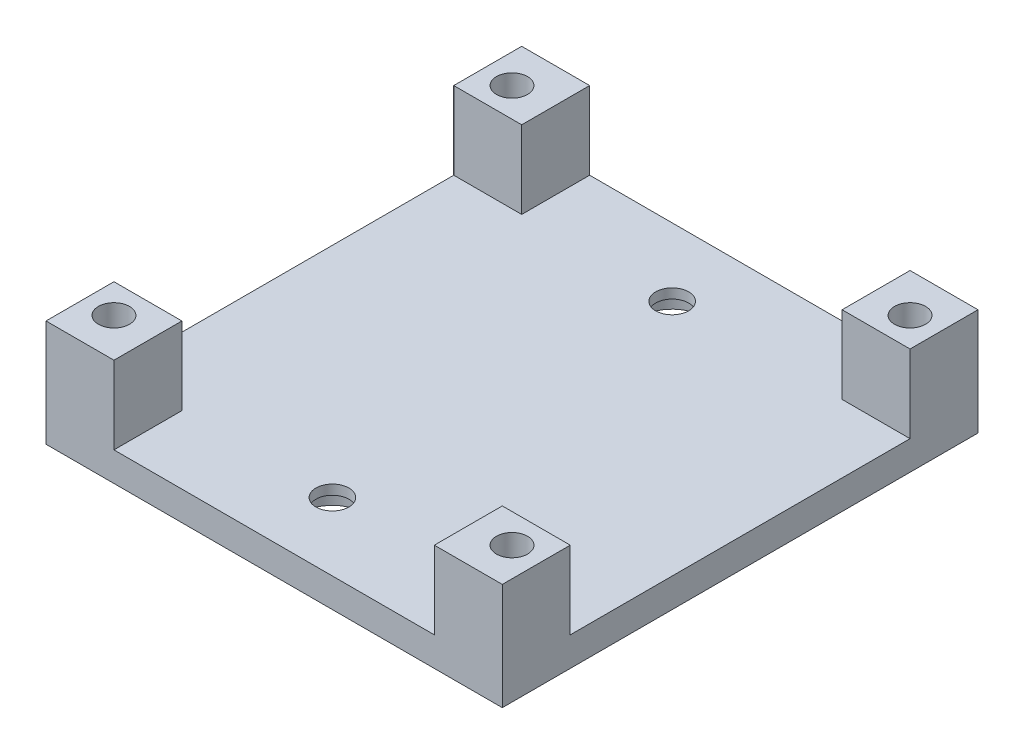
ISO-10303-21;
HEADER;
FILE_DESCRIPTION(('STEP AP214'),'2;1');
FILE_NAME('part.step','',(''),(''),'','','');
FILE_SCHEMA(('AUTOMOTIVE_DESIGN { 1 0 10303 214 1 1 1 1 }'));
ENDSEC;
DATA;
#1=APPLICATION_CONTEXT('core data for automotive mechanical design processes');
#2=APPLICATION_PROTOCOL_DEFINITION('international standard','automotive_design',2000,#1);
#3=PRODUCT_CONTEXT('',#1,'mechanical');
#4=PRODUCT('Part','Part','',(#3));
#5=PRODUCT_RELATED_PRODUCT_CATEGORY('part','',(#4));
#6=PRODUCT_DEFINITION_FORMATION('','',#4);
#7=PRODUCT_DEFINITION_CONTEXT('part definition',#1,'design');
#8=PRODUCT_DEFINITION('design','',#6,#7);
#9=PRODUCT_DEFINITION_SHAPE('','',#8);
#10=(LENGTH_UNIT() NAMED_UNIT(*) SI_UNIT(.MILLI.,.METRE.));
#11=(NAMED_UNIT(*) PLANE_ANGLE_UNIT() SI_UNIT($,.RADIAN.));
#12=(NAMED_UNIT(*) SI_UNIT($,.STERADIAN.) SOLID_ANGLE_UNIT());
#13=UNCERTAINTY_MEASURE_WITH_UNIT(LENGTH_MEASURE(1.E-05),#10,'distance_accuracy_value','');
#14=(GEOMETRIC_REPRESENTATION_CONTEXT(3) GLOBAL_UNCERTAINTY_ASSIGNED_CONTEXT((#13)) GLOBAL_UNIT_ASSIGNED_CONTEXT((#10,
#11,#12)) REPRESENTATION_CONTEXT('',''));
#15=CARTESIAN_POINT('',(0.,0.,0.));
#16=DIRECTION('',(0.,0.,1.));
#17=DIRECTION('',(1.,0.,0.));
#18=AXIS2_PLACEMENT_3D('',#15,#16,#17);
#19=CARTESIAN_POINT('',(0.,3.,0.));
#20=DIRECTION('',(0.,-1.,0.));
#21=DIRECTION('',(0.,0.,-1.));
#22=AXIS2_PLACEMENT_3D('',#19,#20,#21);
#23=PLANE('',#22);
#24=CARTESIAN_POINT('',(22.5,3.,-7.00000000000001));
#25=DIRECTION('',(0.,-1.,0.));
#26=DIRECTION('',(0.,0.,-1.));
#27=AXIS2_PLACEMENT_3D('',#24,#25,#26);
#28=CIRCLE('',#27,1.7);
#29=CARTESIAN_POINT('',(22.5,3.,-8.7));
#30=VERTEX_POINT('',#29);
#31=EDGE_CURVE('E37',#30,#30,#28,.T.);
#32=ORIENTED_EDGE('',*,*,#31,.T.);
#33=EDGE_LOOP('',(#32));
#34=FACE_BOUND('',#33,.T.);
#35=CARTESIAN_POINT('',(22.5,3.,-42.));
#36=DIRECTION('',(0.,-1.,0.));
#37=DIRECTION('',(0.,0.,-1.));
#38=AXIS2_PLACEMENT_3D('',#35,#36,#37);
#39=CIRCLE('',#38,1.7);
#40=CARTESIAN_POINT('',(22.5,3.,-43.7));
#41=VERTEX_POINT('',#40);
#42=EDGE_CURVE('E253',#41,#41,#39,.T.);
#43=ORIENTED_EDGE('',*,*,#42,.T.);
#44=EDGE_LOOP('',(#43));
#45=FACE_BOUND('',#44,.T.);
#46=DIRECTION('',(0.,0.,-1.));
#47=VECTOR('',#46,1.);
#48=CARTESIAN_POINT('',(7.,3.,0.));
#49=LINE('',#48,#47);
#50=CARTESIAN_POINT('',(7.,3.,0.));
#51=VERTEX_POINT('',#50);
#52=CARTESIAN_POINT('',(7.,3.,-7.));
#53=VERTEX_POINT('',#52);
#54=EDGE_CURVE('E524',#51,#53,#49,.T.);
#55=ORIENTED_EDGE('',*,*,#54,.F.);
#56=DIRECTION('',(1.,0.,0.));
#57=VECTOR('',#56,1.);
#58=CARTESIAN_POINT('',(0.,3.,0.));
#59=LINE('',#58,#57);
#60=CARTESIAN_POINT('',(40.,3.,0.));
#61=VERTEX_POINT('',#60);
#62=EDGE_CURVE('E168',#51,#61,#59,.T.);
#63=ORIENTED_EDGE('',*,*,#62,.T.);
#64=DIRECTION('',(0.,0.,1.));
#65=VECTOR('',#64,1.);
#66=CARTESIAN_POINT('',(40.,3.,0.));
#67=LINE('',#66,#65);
#68=CARTESIAN_POINT('',(40.,3.,-7.));
#69=VERTEX_POINT('',#68);
#70=EDGE_CURVE('E172',#69,#61,#67,.T.);
#71=ORIENTED_EDGE('',*,*,#70,.F.);
#72=DIRECTION('',(-1.,0.,0.));
#73=VECTOR('',#72,1.);
#74=CARTESIAN_POINT('',(47.,3.,-7.00000000000001));
#75=LINE('',#74,#73);
#76=CARTESIAN_POINT('',(47.,3.,-7.00000000000001));
#77=VERTEX_POINT('',#76);
#78=EDGE_CURVE('E169',#77,#69,#75,.T.);
#79=ORIENTED_EDGE('',*,*,#78,.F.);
#80=DIRECTION('',(0.,0.,-1.));
#81=VECTOR('',#80,1.);
#82=CARTESIAN_POINT('',(47.,3.,0.));
#83=LINE('',#82,#81);
#84=CARTESIAN_POINT('',(47.,3.,-42.));
#85=VERTEX_POINT('',#84);
#86=EDGE_CURVE('E252',#77,#85,#83,.T.);
#87=ORIENTED_EDGE('',*,*,#86,.T.);
#88=DIRECTION('',(1.,0.,0.));
#89=VECTOR('',#88,1.);
#90=CARTESIAN_POINT('',(47.,3.,-42.));
#91=LINE('',#90,#89);
#92=CARTESIAN_POINT('',(40.,3.,-42.));
#93=VERTEX_POINT('',#92);
#94=EDGE_CURVE('E202',#93,#85,#91,.T.);
#95=ORIENTED_EDGE('',*,*,#94,.F.);
#96=DIRECTION('',(0.,0.,1.));
#97=VECTOR('',#96,1.);
#98=CARTESIAN_POINT('',(40.,3.,-49.));
#99=LINE('',#98,#97);
#100=CARTESIAN_POINT('',(40.,3.,-49.));
#101=VERTEX_POINT('',#100);
#102=EDGE_CURVE('E197',#101,#93,#99,.T.);
#103=ORIENTED_EDGE('',*,*,#102,.F.);
#104=DIRECTION('',(-1.,0.,0.));
#105=VECTOR('',#104,1.);
#106=CARTESIAN_POINT('',(0.,3.,-49.));
#107=LINE('',#106,#105);
#108=CARTESIAN_POINT('',(7.,3.,-49.));
#109=VERTEX_POINT('',#108);
#110=EDGE_CURVE('E249',#101,#109,#107,.T.);
#111=ORIENTED_EDGE('',*,*,#110,.T.);
#112=DIRECTION('',(0.,0.,-1.));
#113=VECTOR('',#112,1.);
#114=CARTESIAN_POINT('',(7.,3.,-49.));
#115=LINE('',#114,#113);
#116=CARTESIAN_POINT('',(7.,3.,-42.));
#117=VERTEX_POINT('',#116);
#118=EDGE_CURVE('E227',#117,#109,#115,.T.);
#119=ORIENTED_EDGE('',*,*,#118,.F.);
#120=DIRECTION('',(1.,0.,0.));
#121=VECTOR('',#120,1.);
#122=CARTESIAN_POINT('',(0.,3.,-42.));
#123=LINE('',#122,#121);
#124=CARTESIAN_POINT('',(0.,3.,-42.));
#125=VERTEX_POINT('',#124);
#126=EDGE_CURVE('E222',#125,#117,#123,.T.);
#127=ORIENTED_EDGE('',*,*,#126,.F.);
#128=DIRECTION('',(0.,0.,1.));
#129=VECTOR('',#128,1.);
#130=CARTESIAN_POINT('',(0.,3.,0.));
#131=LINE('',#130,#129);
#132=CARTESIAN_POINT('',(0.,3.,-7.));
#133=VERTEX_POINT('',#132);
#134=EDGE_CURVE('E55',#125,#133,#131,.T.);
#135=ORIENTED_EDGE('',*,*,#134,.T.);
#136=DIRECTION('',(-1.,0.,0.));
#137=VECTOR('',#136,1.);
#138=CARTESIAN_POINT('',(0.,3.,-7.));
#139=LINE('',#138,#137);
#140=EDGE_CURVE('E50',#53,#133,#139,.T.);
#141=ORIENTED_EDGE('',*,*,#140,.F.);
#142=EDGE_LOOP('',(#55,#63,#71,#79,#87,#95,#103,#111,#119,#127,#135,#141));
#143=FACE_BOUND('',#142,.T.);
#144=ADVANCED_FACE('F33',(#34,#45,#143),#23,.F.);
#145=CARTESIAN_POINT('',(0.,3.,0.));
#146=DIRECTION('',(1.,0.,0.));
#147=DIRECTION('',(0.,0.,-1.));
#148=AXIS2_PLACEMENT_3D('',#145,#146,#147);
#149=PLANE('',#148);
#150=DIRECTION('',(0.,0.,1.));
#151=VECTOR('',#150,1.);
#152=CARTESIAN_POINT('',(0.,0.,0.));
#153=LINE('',#152,#151);
#154=CARTESIAN_POINT('',(0.,0.,-49.));
#155=VERTEX_POINT('',#154);
#156=CARTESIAN_POINT('',(0.,0.,0.));
#157=VERTEX_POINT('',#156);
#158=EDGE_CURVE('E258',#155,#157,#153,.T.);
#159=ORIENTED_EDGE('',*,*,#158,.T.);
#160=DIRECTION('',(0.,-1.,0.));
#161=VECTOR('',#160,1.);
#162=CARTESIAN_POINT('',(0.,3.,0.));
#163=LINE('',#162,#161);
#164=CARTESIAN_POINT('',(0.,11.,0.));
#165=VERTEX_POINT('',#164);
#166=EDGE_CURVE('E11',#165,#157,#163,.T.);
#167=ORIENTED_EDGE('',*,*,#166,.F.);
#168=DIRECTION('',(0.,0.,1.));
#169=VECTOR('',#168,1.);
#170=CARTESIAN_POINT('',(0.,11.,0.));
#171=LINE('',#170,#169);
#172=CARTESIAN_POINT('',(0.,11.,-7.));
#173=VERTEX_POINT('',#172);
#174=EDGE_CURVE('E163',#173,#165,#171,.T.);
#175=ORIENTED_EDGE('',*,*,#174,.F.);
#176=DIRECTION('',(0.,-1.,0.));
#177=VECTOR('',#176,1.);
#178=CARTESIAN_POINT('',(0.,11.,-7.));
#179=LINE('',#178,#177);
#180=EDGE_CURVE('E174',#173,#133,#179,.T.);
#181=ORIENTED_EDGE('',*,*,#180,.T.);
#182=ORIENTED_EDGE('',*,*,#134,.F.);
#183=DIRECTION('',(0.,-1.,0.));
#184=VECTOR('',#183,1.);
#185=CARTESIAN_POINT('',(0.,11.,-42.));
#186=LINE('',#185,#184);
#187=CARTESIAN_POINT('',(0.,11.,-42.));
#188=VERTEX_POINT('',#187);
#189=EDGE_CURVE('E262',#188,#125,#186,.T.);
#190=ORIENTED_EDGE('',*,*,#189,.F.);
#191=DIRECTION('',(0.,0.,1.));
#192=VECTOR('',#191,1.);
#193=CARTESIAN_POINT('',(0.,11.,-49.));
#194=LINE('',#193,#192);
#195=CARTESIAN_POINT('',(0.,11.,-49.));
#196=VERTEX_POINT('',#195);
#197=EDGE_CURVE('E223',#196,#188,#194,.T.);
#198=ORIENTED_EDGE('',*,*,#197,.F.);
#199=DIRECTION('',(0.,-1.,0.));
#200=VECTOR('',#199,1.);
#201=CARTESIAN_POINT('',(0.,3.,-49.));
#202=LINE('',#201,#200);
#203=EDGE_CURVE('E251',#196,#155,#202,.T.);
#204=ORIENTED_EDGE('',*,*,#203,.T.);
#205=EDGE_LOOP('',(#159,#167,#175,#181,#182,#190,#198,#204));
#206=FACE_BOUND('',#205,.T.);
#207=ADVANCED_FACE('F35',(#206),#149,.F.);
#208=CARTESIAN_POINT('',(0.,3.,0.));
#209=DIRECTION('',(0.,0.,-1.));
#210=DIRECTION('',(-1.,0.,0.));
#211=AXIS2_PLACEMENT_3D('',#208,#209,#210);
#212=PLANE('',#211);
#213=DIRECTION('',(1.,0.,0.));
#214=VECTOR('',#213,1.);
#215=CARTESIAN_POINT('',(0.,0.,0.));
#216=LINE('',#215,#214);
#217=CARTESIAN_POINT('',(47.,0.,0.));
#218=VERTEX_POINT('',#217);
#219=EDGE_CURVE('E261',#157,#218,#216,.T.);
#220=ORIENTED_EDGE('',*,*,#219,.T.);
#221=DIRECTION('',(0.,-1.,0.));
#222=VECTOR('',#221,1.);
#223=CARTESIAN_POINT('',(47.,3.,0.));
#224=LINE('',#223,#222);
#225=CARTESIAN_POINT('',(47.,11.,0.));
#226=VERTEX_POINT('',#225);
#227=EDGE_CURVE('E42',#226,#218,#224,.T.);
#228=ORIENTED_EDGE('',*,*,#227,.F.);
#229=DIRECTION('',(1.,0.,0.));
#230=VECTOR('',#229,1.);
#231=CARTESIAN_POINT('',(47.,11.,0.));
#232=LINE('',#231,#230);
#233=CARTESIAN_POINT('',(40.,11.,0.));
#234=VERTEX_POINT('',#233);
#235=EDGE_CURVE('E178',#234,#226,#232,.T.);
#236=ORIENTED_EDGE('',*,*,#235,.F.);
#237=DIRECTION('',(0.,-1.,0.));
#238=VECTOR('',#237,1.);
#239=CARTESIAN_POINT('',(40.,11.,0.));
#240=LINE('',#239,#238);
#241=EDGE_CURVE('E186',#234,#61,#240,.T.);
#242=ORIENTED_EDGE('',*,*,#241,.T.);
#243=ORIENTED_EDGE('',*,*,#62,.F.);
#244=DIRECTION('',(0.,-1.,0.));
#245=VECTOR('',#244,1.);
#246=CARTESIAN_POINT('',(7.,11.,0.));
#247=LINE('',#246,#245);
#248=CARTESIAN_POINT('',(7.,11.,0.));
#249=VERTEX_POINT('',#248);
#250=EDGE_CURVE('E151',#249,#51,#247,.T.);
#251=ORIENTED_EDGE('',*,*,#250,.F.);
#252=DIRECTION('',(1.,0.,0.));
#253=VECTOR('',#252,1.);
#254=CARTESIAN_POINT('',(0.,11.,0.));
#255=LINE('',#254,#253);
#256=EDGE_CURVE('E157',#165,#249,#255,.T.);
#257=ORIENTED_EDGE('',*,*,#256,.F.);
#258=ORIENTED_EDGE('',*,*,#166,.T.);
#259=EDGE_LOOP('',(#220,#228,#236,#242,#243,#251,#257,#258));
#260=FACE_BOUND('',#259,.T.);
#261=ADVANCED_FACE('F166',(#260),#212,.F.);
#262=CARTESIAN_POINT('',(47.,3.,0.));
#263=DIRECTION('',(-1.,0.,0.));
#264=DIRECTION('',(0.,0.,1.));
#265=AXIS2_PLACEMENT_3D('',#262,#263,#264);
#266=PLANE('',#265);
#267=DIRECTION('',(0.,0.,-1.));
#268=VECTOR('',#267,1.);
#269=CARTESIAN_POINT('',(47.,0.,0.));
#270=LINE('',#269,#268);
#271=CARTESIAN_POINT('',(47.,0.,-49.));
#272=VERTEX_POINT('',#271);
#273=EDGE_CURVE('E264',#218,#272,#270,.T.);
#274=ORIENTED_EDGE('',*,*,#273,.T.);
#275=DIRECTION('',(0.,-1.,0.));
#276=VECTOR('',#275,1.);
#277=CARTESIAN_POINT('',(47.,3.,-49.));
#278=LINE('',#277,#276);
#279=CARTESIAN_POINT('',(47.,11.,-49.));
#280=VERTEX_POINT('',#279);
#281=EDGE_CURVE('E270',#280,#272,#278,.T.);
#282=ORIENTED_EDGE('',*,*,#281,.F.);
#283=DIRECTION('',(0.,0.,-1.));
#284=VECTOR('',#283,1.);
#285=CARTESIAN_POINT('',(47.,11.,-49.));
#286=LINE('',#285,#284);
#287=CARTESIAN_POINT('',(47.,11.,-42.));
#288=VERTEX_POINT('',#287);
#289=EDGE_CURVE('E206',#288,#280,#286,.T.);
#290=ORIENTED_EDGE('',*,*,#289,.F.);
#291=DIRECTION('',(0.,-1.,0.));
#292=VECTOR('',#291,1.);
#293=CARTESIAN_POINT('',(47.,11.,-42.));
#294=LINE('',#293,#292);
#295=EDGE_CURVE('E209',#288,#85,#294,.T.);
#296=ORIENTED_EDGE('',*,*,#295,.T.);
#297=ORIENTED_EDGE('',*,*,#86,.F.);
#298=DIRECTION('',(0.,-1.,0.));
#299=VECTOR('',#298,1.);
#300=CARTESIAN_POINT('',(47.,11.,-7.00000000000001));
#301=LINE('',#300,#299);
#302=CARTESIAN_POINT('',(47.,11.,-7.00000000000001));
#303=VERTEX_POINT('',#302);
#304=EDGE_CURVE('E194',#303,#77,#301,.T.);
#305=ORIENTED_EDGE('',*,*,#304,.F.);
#306=DIRECTION('',(0.,0.,-1.));
#307=VECTOR('',#306,1.);
#308=CARTESIAN_POINT('',(47.,11.,0.));
#309=LINE('',#308,#307);
#310=EDGE_CURVE('E181',#226,#303,#309,.T.);
#311=ORIENTED_EDGE('',*,*,#310,.F.);
#312=ORIENTED_EDGE('',*,*,#227,.T.);
#313=EDGE_LOOP('',(#274,#282,#290,#296,#297,#305,#311,#312));
#314=FACE_BOUND('',#313,.T.);
#315=ADVANCED_FACE('F288',(#314),#266,.F.);
#316=CARTESIAN_POINT('',(0.,3.,-49.));
#317=DIRECTION('',(0.,0.,1.));
#318=DIRECTION('',(1.,0.,0.));
#319=AXIS2_PLACEMENT_3D('',#316,#317,#318);
#320=PLANE('',#319);
#321=DIRECTION('',(-1.,0.,0.));
#322=VECTOR('',#321,1.);
#323=CARTESIAN_POINT('',(0.,0.,-49.));
#324=LINE('',#323,#322);
#325=EDGE_CURVE('E266',#272,#155,#324,.T.);
#326=ORIENTED_EDGE('',*,*,#325,.T.);
#327=ORIENTED_EDGE('',*,*,#203,.F.);
#328=DIRECTION('',(-1.,0.,0.));
#329=VECTOR('',#328,1.);
#330=CARTESIAN_POINT('',(0.,11.,-49.));
#331=LINE('',#330,#329);
#332=CARTESIAN_POINT('',(7.,11.,-49.));
#333=VERTEX_POINT('',#332);
#334=EDGE_CURVE('E231',#333,#196,#331,.T.);
#335=ORIENTED_EDGE('',*,*,#334,.F.);
#336=DIRECTION('',(0.,-1.,0.));
#337=VECTOR('',#336,1.);
#338=CARTESIAN_POINT('',(7.,11.,-49.));
#339=LINE('',#338,#337);
#340=EDGE_CURVE('E234',#333,#109,#339,.T.);
#341=ORIENTED_EDGE('',*,*,#340,.T.);
#342=ORIENTED_EDGE('',*,*,#110,.F.);
#343=DIRECTION('',(0.,-1.,0.));
#344=VECTOR('',#343,1.);
#345=CARTESIAN_POINT('',(40.,11.,-49.));
#346=LINE('',#345,#344);
#347=CARTESIAN_POINT('',(40.,11.,-49.));
#348=VERTEX_POINT('',#347);
#349=EDGE_CURVE('E219',#348,#101,#346,.T.);
#350=ORIENTED_EDGE('',*,*,#349,.F.);
#351=DIRECTION('',(-1.,0.,0.));
#352=VECTOR('',#351,1.);
#353=CARTESIAN_POINT('',(47.,11.,-49.));
#354=LINE('',#353,#352);
#355=EDGE_CURVE('E198',#280,#348,#354,.T.);
#356=ORIENTED_EDGE('',*,*,#355,.F.);
#357=ORIENTED_EDGE('',*,*,#281,.T.);
#358=EDGE_LOOP('',(#326,#327,#335,#341,#342,#350,#356,#357));
#359=FACE_BOUND('',#358,.T.);
#360=ADVANCED_FACE('F294',(#359),#320,.F.);
#361=CARTESIAN_POINT('',(0.,0.,0.));
#362=DIRECTION('',(0.,-1.,0.));
#363=DIRECTION('',(0.,0.,-1.));
#364=AXIS2_PLACEMENT_3D('',#361,#362,#363);
#365=PLANE('',#364);
#366=CARTESIAN_POINT('',(11.75,0.,-36.75));
#367=DIRECTION('',(0.,-1.,0.));
#368=DIRECTION('',(0.,0.,1.));
#369=AXIS2_PLACEMENT_3D('',#366,#367,#368);
#370=CIRCLE('',#369,4.75);
#371=CARTESIAN_POINT('',(11.75,0.,-32.));
#372=VERTEX_POINT('',#371);
#373=EDGE_CURVE('E599',#372,#372,#370,.T.);
#374=ORIENTED_EDGE('',*,*,#373,.F.);
#375=EDGE_LOOP('',(#374));
#376=FACE_BOUND('',#375,.T.);
#377=CARTESIAN_POINT('',(35.25,0.,-36.75));
#378=DIRECTION('',(0.,-1.,0.));
#379=DIRECTION('',(0.,0.,-1.));
#380=AXIS2_PLACEMENT_3D('',#377,#378,#379);
#381=CIRCLE('',#380,4.75);
#382=CARTESIAN_POINT('',(35.25,0.,-41.5));
#383=VERTEX_POINT('',#382);
#384=EDGE_CURVE('E593',#383,#383,#381,.T.);
#385=ORIENTED_EDGE('',*,*,#384,.F.);
#386=EDGE_LOOP('',(#385));
#387=FACE_BOUND('',#386,.T.);
#388=CARTESIAN_POINT('',(35.25,0.,-12.25));
#389=DIRECTION('',(0.,-1.,0.));
#390=DIRECTION('',(0.,0.,1.));
#391=AXIS2_PLACEMENT_3D('',#388,#389,#390);
#392=CIRCLE('',#391,4.75);
#393=CARTESIAN_POINT('',(35.25,0.,-7.5));
#394=VERTEX_POINT('',#393);
#395=EDGE_CURVE('E587',#394,#394,#392,.T.);
#396=ORIENTED_EDGE('',*,*,#395,.F.);
#397=EDGE_LOOP('',(#396));
#398=FACE_BOUND('',#397,.T.);
#399=CARTESIAN_POINT('',(11.75,0.,-12.25));
#400=DIRECTION('',(0.,-1.,0.));
#401=DIRECTION('',(0.,0.,-1.));
#402=AXIS2_PLACEMENT_3D('',#399,#400,#401);
#403=CIRCLE('',#402,4.75);
#404=CARTESIAN_POINT('',(11.75,0.,-17.));
#405=VERTEX_POINT('',#404);
#406=EDGE_CURVE('E581',#405,#405,#403,.T.);
#407=ORIENTED_EDGE('',*,*,#406,.F.);
#408=EDGE_LOOP('',(#407));
#409=FACE_BOUND('',#408,.T.);
#410=CARTESIAN_POINT('',(22.5,0.,-7.00000000000001));
#411=DIRECTION('',(0.,-1.,0.));
#412=DIRECTION('',(0.,0.,-1.));
#413=AXIS2_PLACEMENT_3D('',#410,#411,#412);
#414=CIRCLE('',#413,3.25);
#415=CARTESIAN_POINT('',(22.5,0.,-10.25));
#416=VERTEX_POINT('',#415);
#417=EDGE_CURVE('E577',#416,#416,#414,.T.);
#418=ORIENTED_EDGE('',*,*,#417,.F.);
#419=EDGE_LOOP('',(#418));
#420=FACE_BOUND('',#419,.T.);
#421=CARTESIAN_POINT('',(22.5,0.,-42.));
#422=DIRECTION('',(0.,-1.,0.));
#423=DIRECTION('',(0.,0.,-1.));
#424=AXIS2_PLACEMENT_3D('',#421,#422,#423);
#425=CIRCLE('',#424,3.25);
#426=CARTESIAN_POINT('',(22.5,0.,-45.25));
#427=VERTEX_POINT('',#426);
#428=EDGE_CURVE('E568',#427,#427,#425,.T.);
#429=ORIENTED_EDGE('',*,*,#428,.F.);
#430=EDGE_LOOP('',(#429));
#431=FACE_BOUND('',#430,.T.);
#432=CARTESIAN_POINT('',(3.,0.,-4.));
#433=DIRECTION('',(0.,-1.,0.));
#434=DIRECTION('',(0.,0.,-1.));
#435=AXIS2_PLACEMENT_3D('',#432,#433,#434);
#436=CIRCLE('',#435,1.59999999999999);
#437=CARTESIAN_POINT('',(3.,0.,-5.59999999999999));
#438=VERTEX_POINT('',#437);
#439=EDGE_CURVE('E559',#438,#438,#436,.T.);
#440=ORIENTED_EDGE('',*,*,#439,.F.);
#441=EDGE_LOOP('',(#440));
#442=FACE_BOUND('',#441,.T.);
#443=CARTESIAN_POINT('',(44.,0.,-4.));
#444=DIRECTION('',(0.,-1.,0.));
#445=DIRECTION('',(0.,0.,-1.));
#446=AXIS2_PLACEMENT_3D('',#443,#444,#445);
#447=CIRCLE('',#446,1.59999999999999);
#448=CARTESIAN_POINT('',(44.,0.,-5.59999999999999));
#449=VERTEX_POINT('',#448);
#450=EDGE_CURVE('E553',#449,#449,#447,.T.);
#451=ORIENTED_EDGE('',*,*,#450,.F.);
#452=EDGE_LOOP('',(#451));
#453=FACE_BOUND('',#452,.T.);
#454=CARTESIAN_POINT('',(44.,0.,-45.));
#455=DIRECTION('',(0.,-1.,0.));
#456=DIRECTION('',(0.,0.,-1.));
#457=AXIS2_PLACEMENT_3D('',#454,#455,#456);
#458=CIRCLE('',#457,1.59999999999999);
#459=CARTESIAN_POINT('',(44.,0.,-46.6));
#460=VERTEX_POINT('',#459);
#461=EDGE_CURVE('E547',#460,#460,#458,.T.);
#462=ORIENTED_EDGE('',*,*,#461,.F.);
#463=EDGE_LOOP('',(#462));
#464=FACE_BOUND('',#463,.T.);
#465=CARTESIAN_POINT('',(3.,0.,-45.));
#466=DIRECTION('',(0.,-1.,0.));
#467=DIRECTION('',(0.,0.,-1.));
#468=AXIS2_PLACEMENT_3D('',#465,#466,#467);
#469=CIRCLE('',#468,1.59999999999999);
#470=CARTESIAN_POINT('',(3.,0.,-46.6));
#471=VERTEX_POINT('',#470);
#472=EDGE_CURVE('E525',#471,#471,#469,.T.);
#473=ORIENTED_EDGE('',*,*,#472,.F.);
#474=EDGE_LOOP('',(#473));
#475=FACE_BOUND('',#474,.T.);
#476=ORIENTED_EDGE('',*,*,#158,.F.);
#477=ORIENTED_EDGE('',*,*,#325,.F.);
#478=ORIENTED_EDGE('',*,*,#273,.F.);
#479=ORIENTED_EDGE('',*,*,#219,.F.);
#480=EDGE_LOOP('',(#476,#477,#478,#479));
#481=FACE_BOUND('',#480,.T.);
#482=ADVANCED_FACE('F318',(#376,#387,#398,#409,#420,#431,#442,#453,#464,#475,#481),#365,.T.);
#483=CARTESIAN_POINT('',(0.,11.,-42.));
#484=DIRECTION('',(0.,0.,-1.));
#485=DIRECTION('',(-1.,0.,0.));
#486=AXIS2_PLACEMENT_3D('',#483,#484,#485);
#487=PLANE('',#486);
#488=ORIENTED_EDGE('',*,*,#126,.T.);
#489=DIRECTION('',(0.,-1.,0.));
#490=VECTOR('',#489,1.);
#491=CARTESIAN_POINT('',(7.,11.,-42.));
#492=LINE('',#491,#490);
#493=CARTESIAN_POINT('',(7.,11.,-42.));
#494=VERTEX_POINT('',#493);
#495=EDGE_CURVE('E237',#494,#117,#492,.T.);
#496=ORIENTED_EDGE('',*,*,#495,.F.);
#497=DIRECTION('',(1.,0.,0.));
#498=VECTOR('',#497,1.);
#499=CARTESIAN_POINT('',(0.,11.,-42.));
#500=LINE('',#499,#498);
#501=EDGE_CURVE('E226',#188,#494,#500,.T.);
#502=ORIENTED_EDGE('',*,*,#501,.F.);
#503=ORIENTED_EDGE('',*,*,#189,.T.);
#504=EDGE_LOOP('',(#488,#496,#502,#503));
#505=FACE_BOUND('',#504,.T.);
#506=ADVANCED_FACE('F316',(#505),#487,.F.);
#507=CARTESIAN_POINT('',(7.,11.,-49.));
#508=DIRECTION('',(-1.,0.,0.));
#509=DIRECTION('',(0.,0.,1.));
#510=AXIS2_PLACEMENT_3D('',#507,#508,#509);
#511=PLANE('',#510);
#512=ORIENTED_EDGE('',*,*,#118,.T.);
#513=ORIENTED_EDGE('',*,*,#340,.F.);
#514=DIRECTION('',(0.,0.,-1.));
#515=VECTOR('',#514,1.);
#516=CARTESIAN_POINT('',(7.,11.,-49.));
#517=LINE('',#516,#515);
#518=EDGE_CURVE('E229',#494,#333,#517,.T.);
#519=ORIENTED_EDGE('',*,*,#518,.F.);
#520=ORIENTED_EDGE('',*,*,#495,.T.);
#521=EDGE_LOOP('',(#512,#513,#519,#520));
#522=FACE_BOUND('',#521,.T.);
#523=ADVANCED_FACE('F302',(#522),#511,.F.);
#524=CARTESIAN_POINT('',(0.,11.,0.));
#525=DIRECTION('',(0.,1.,0.));
#526=DIRECTION('',(0.,0.,1.));
#527=AXIS2_PLACEMENT_3D('',#524,#525,#526);
#528=PLANE('',#527);
#529=CARTESIAN_POINT('',(3.,11.,-45.));
#530=DIRECTION('',(0.,1.,0.));
#531=DIRECTION('',(0.,0.,1.));
#532=AXIS2_PLACEMENT_3D('',#529,#530,#531);
#533=CIRCLE('',#532,1.59999999999999);
#534=CARTESIAN_POINT('',(3.,11.,-43.4));
#535=VERTEX_POINT('',#534);
#536=EDGE_CURVE('E522',#535,#535,#533,.T.);
#537=ORIENTED_EDGE('',*,*,#536,.F.);
#538=EDGE_LOOP('',(#537));
#539=FACE_BOUND('',#538,.T.);
#540=ORIENTED_EDGE('',*,*,#197,.T.);
#541=ORIENTED_EDGE('',*,*,#501,.T.);
#542=ORIENTED_EDGE('',*,*,#518,.T.);
#543=ORIENTED_EDGE('',*,*,#334,.T.);
#544=EDGE_LOOP('',(#540,#541,#542,#543));
#545=FACE_BOUND('',#544,.T.);
#546=ADVANCED_FACE('F308',(#539,#545),#528,.T.);
#547=CARTESIAN_POINT('',(40.,11.,-49.));
#548=DIRECTION('',(1.,0.,0.));
#549=DIRECTION('',(0.,0.,-1.));
#550=AXIS2_PLACEMENT_3D('',#547,#548,#549);
#551=PLANE('',#550);
#552=ORIENTED_EDGE('',*,*,#102,.T.);
#553=DIRECTION('',(0.,-1.,0.));
#554=VECTOR('',#553,1.);
#555=CARTESIAN_POINT('',(40.,11.,-42.));
#556=LINE('',#555,#554);
#557=CARTESIAN_POINT('',(40.,11.,-42.));
#558=VERTEX_POINT('',#557);
#559=EDGE_CURVE('E216',#558,#93,#556,.T.);
#560=ORIENTED_EDGE('',*,*,#559,.F.);
#561=DIRECTION('',(0.,0.,1.));
#562=VECTOR('',#561,1.);
#563=CARTESIAN_POINT('',(40.,11.,-49.));
#564=LINE('',#563,#562);
#565=EDGE_CURVE('E201',#348,#558,#564,.T.);
#566=ORIENTED_EDGE('',*,*,#565,.F.);
#567=ORIENTED_EDGE('',*,*,#349,.T.);
#568=EDGE_LOOP('',(#552,#560,#566,#567));
#569=FACE_BOUND('',#568,.T.);
#570=ADVANCED_FACE('F297',(#569),#551,.F.);
#571=CARTESIAN_POINT('',(47.,11.,-42.));
#572=DIRECTION('',(0.,0.,-1.));
#573=DIRECTION('',(-1.,0.,0.));
#574=AXIS2_PLACEMENT_3D('',#571,#572,#573);
#575=PLANE('',#574);
#576=ORIENTED_EDGE('',*,*,#94,.T.);
#577=ORIENTED_EDGE('',*,*,#295,.F.);
#578=DIRECTION('',(1.,0.,0.));
#579=VECTOR('',#578,1.);
#580=CARTESIAN_POINT('',(47.,11.,-42.));
#581=LINE('',#580,#579);
#582=EDGE_CURVE('E204',#558,#288,#581,.T.);
#583=ORIENTED_EDGE('',*,*,#582,.F.);
#584=ORIENTED_EDGE('',*,*,#559,.T.);
#585=EDGE_LOOP('',(#576,#577,#583,#584));
#586=FACE_BOUND('',#585,.T.);
#587=ADVANCED_FACE('F284',(#586),#575,.F.);
#588=CARTESIAN_POINT('',(0.,11.,0.));
#589=DIRECTION('',(0.,1.,0.));
#590=DIRECTION('',(0.,0.,1.));
#591=AXIS2_PLACEMENT_3D('',#588,#589,#590);
#592=PLANE('',#591);
#593=CARTESIAN_POINT('',(44.,11.,-45.));
#594=DIRECTION('',(0.,1.,0.));
#595=DIRECTION('',(0.,0.,1.));
#596=AXIS2_PLACEMENT_3D('',#593,#594,#595);
#597=CIRCLE('',#596,1.59999999999999);
#598=CARTESIAN_POINT('',(44.,11.,-43.4));
#599=VERTEX_POINT('',#598);
#600=EDGE_CURVE('E529',#599,#599,#597,.T.);
#601=ORIENTED_EDGE('',*,*,#600,.F.);
#602=EDGE_LOOP('',(#601));
#603=FACE_BOUND('',#602,.T.);
#604=ORIENTED_EDGE('',*,*,#355,.T.);
#605=ORIENTED_EDGE('',*,*,#565,.T.);
#606=ORIENTED_EDGE('',*,*,#582,.T.);
#607=ORIENTED_EDGE('',*,*,#289,.T.);
#608=EDGE_LOOP('',(#604,#605,#606,#607));
#609=FACE_BOUND('',#608,.T.);
#610=ADVANCED_FACE('F291',(#603,#609),#592,.T.);
#611=CARTESIAN_POINT('',(47.,11.,-7.00000000000001));
#612=DIRECTION('',(0.,0.,1.));
#613=DIRECTION('',(1.,0.,0.));
#614=AXIS2_PLACEMENT_3D('',#611,#612,#613);
#615=PLANE('',#614);
#616=ORIENTED_EDGE('',*,*,#78,.T.);
#617=DIRECTION('',(0.,-1.,0.));
#618=VECTOR('',#617,1.);
#619=CARTESIAN_POINT('',(40.,11.,-7.));
#620=LINE('',#619,#618);
#621=CARTESIAN_POINT('',(40.,11.,-7.));
#622=VERTEX_POINT('',#621);
#623=EDGE_CURVE('E191',#622,#69,#620,.T.);
#624=ORIENTED_EDGE('',*,*,#623,.F.);
#625=DIRECTION('',(-1.,0.,0.));
#626=VECTOR('',#625,1.);
#627=CARTESIAN_POINT('',(47.,11.,-7.00000000000001));
#628=LINE('',#627,#626);
#629=EDGE_CURVE('E183',#303,#622,#628,.T.);
#630=ORIENTED_EDGE('',*,*,#629,.F.);
#631=ORIENTED_EDGE('',*,*,#304,.T.);
#632=EDGE_LOOP('',(#616,#624,#630,#631));
#633=FACE_BOUND('',#632,.T.);
#634=ADVANCED_FACE('F504',(#633),#615,.F.);
#635=CARTESIAN_POINT('',(40.,11.,0.));
#636=DIRECTION('',(1.,0.,0.));
#637=DIRECTION('',(0.,0.,-1.));
#638=AXIS2_PLACEMENT_3D('',#635,#636,#637);
#639=PLANE('',#638);
#640=ORIENTED_EDGE('',*,*,#70,.T.);
#641=ORIENTED_EDGE('',*,*,#241,.F.);
#642=DIRECTION('',(0.,0.,1.));
#643=VECTOR('',#642,1.);
#644=CARTESIAN_POINT('',(40.,11.,0.));
#645=LINE('',#644,#643);
#646=EDGE_CURVE('E185',#622,#234,#645,.T.);
#647=ORIENTED_EDGE('',*,*,#646,.F.);
#648=ORIENTED_EDGE('',*,*,#623,.T.);
#649=EDGE_LOOP('',(#640,#641,#647,#648));
#650=FACE_BOUND('',#649,.T.);
#651=ADVANCED_FACE('F500',(#650),#639,.F.);
#652=CARTESIAN_POINT('',(0.,11.,0.));
#653=DIRECTION('',(0.,-1.,0.));
#654=DIRECTION('',(0.,0.,-1.));
#655=AXIS2_PLACEMENT_3D('',#652,#653,#654);
#656=PLANE('',#655);
#657=CARTESIAN_POINT('',(44.,11.,-4.));
#658=DIRECTION('',(0.,-1.,0.));
#659=DIRECTION('',(0.,0.,-1.));
#660=AXIS2_PLACEMENT_3D('',#657,#658,#659);
#661=CIRCLE('',#660,1.59999999999999);
#662=CARTESIAN_POINT('',(44.,11.,-5.6));
#663=VERTEX_POINT('',#662);
#664=EDGE_CURVE('E550',#663,#663,#661,.T.);
#665=ORIENTED_EDGE('',*,*,#664,.T.);
#666=EDGE_LOOP('',(#665));
#667=FACE_BOUND('',#666,.T.);
#668=ORIENTED_EDGE('',*,*,#235,.T.);
#669=ORIENTED_EDGE('',*,*,#310,.T.);
#670=ORIENTED_EDGE('',*,*,#629,.T.);
#671=ORIENTED_EDGE('',*,*,#646,.T.);
#672=EDGE_LOOP('',(#668,#669,#670,#671));
#673=FACE_BOUND('',#672,.T.);
#674=ADVANCED_FACE('F497',(#667,#673),#656,.F.);
#675=CARTESIAN_POINT('',(7.,11.,0.));
#676=DIRECTION('',(-1.,0.,0.));
#677=DIRECTION('',(0.,0.,1.));
#678=AXIS2_PLACEMENT_3D('',#675,#676,#677);
#679=PLANE('',#678);
#680=ORIENTED_EDGE('',*,*,#54,.T.);
#681=DIRECTION('',(0.,-1.,0.));
#682=VECTOR('',#681,1.);
#683=CARTESIAN_POINT('',(7.,11.,-7.));
#684=LINE('',#683,#682);
#685=CARTESIAN_POINT('',(7.,11.,-7.));
#686=VERTEX_POINT('',#685);
#687=EDGE_CURVE('E153',#686,#53,#684,.T.);
#688=ORIENTED_EDGE('',*,*,#687,.F.);
#689=DIRECTION('',(0.,0.,-1.));
#690=VECTOR('',#689,1.);
#691=CARTESIAN_POINT('',(7.,11.,0.));
#692=LINE('',#691,#690);
#693=EDGE_CURVE('E147',#249,#686,#692,.T.);
#694=ORIENTED_EDGE('',*,*,#693,.F.);
#695=ORIENTED_EDGE('',*,*,#250,.T.);
#696=EDGE_LOOP('',(#680,#688,#694,#695));
#697=FACE_BOUND('',#696,.T.);
#698=ADVANCED_FACE('F149',(#697),#679,.F.);
#699=CARTESIAN_POINT('',(0.,11.,-7.));
#700=DIRECTION('',(0.,0.,1.));
#701=DIRECTION('',(1.,0.,0.));
#702=AXIS2_PLACEMENT_3D('',#699,#700,#701);
#703=PLANE('',#702);
#704=ORIENTED_EDGE('',*,*,#140,.T.);
#705=ORIENTED_EDGE('',*,*,#180,.F.);
#706=DIRECTION('',(-1.,0.,0.));
#707=VECTOR('',#706,1.);
#708=CARTESIAN_POINT('',(0.,11.,-7.));
#709=LINE('',#708,#707);
#710=EDGE_CURVE('E156',#686,#173,#709,.T.);
#711=ORIENTED_EDGE('',*,*,#710,.F.);
#712=ORIENTED_EDGE('',*,*,#687,.T.);
#713=EDGE_LOOP('',(#704,#705,#711,#712));
#714=FACE_BOUND('',#713,.T.);
#715=ADVANCED_FACE('F490',(#714),#703,.F.);
#716=CARTESIAN_POINT('',(0.,11.,0.));
#717=DIRECTION('',(0.,1.,0.));
#718=DIRECTION('',(0.,0.,1.));
#719=AXIS2_PLACEMENT_3D('',#716,#717,#718);
#720=PLANE('',#719);
#721=CARTESIAN_POINT('',(3.,11.,-4.));
#722=DIRECTION('',(0.,1.,0.));
#723=DIRECTION('',(0.,0.,1.));
#724=AXIS2_PLACEMENT_3D('',#721,#722,#723);
#725=CIRCLE('',#724,1.59999999999999);
#726=CARTESIAN_POINT('',(3.,11.,-2.40000000000001));
#727=VERTEX_POINT('',#726);
#728=EDGE_CURVE('E556',#727,#727,#725,.T.);
#729=ORIENTED_EDGE('',*,*,#728,.F.);
#730=EDGE_LOOP('',(#729));
#731=FACE_BOUND('',#730,.T.);
#732=ORIENTED_EDGE('',*,*,#256,.T.);
#733=ORIENTED_EDGE('',*,*,#693,.T.);
#734=ORIENTED_EDGE('',*,*,#710,.T.);
#735=ORIENTED_EDGE('',*,*,#174,.T.);
#736=EDGE_LOOP('',(#732,#733,#734,#735));
#737=FACE_BOUND('',#736,.T.);
#738=ADVANCED_FACE('F161',(#731,#737),#720,.T.);
#739=CARTESIAN_POINT('',(3.,0.,-45.));
#740=DIRECTION('',(0.,-1.,0.));
#741=DIRECTION('',(0.,0.,-1.));
#742=AXIS2_PLACEMENT_3D('',#739,#740,#741);
#743=CYLINDRICAL_SURFACE('',#742,1.59999999999999);
#744=ORIENTED_EDGE('',*,*,#472,.T.);
#745=EDGE_LOOP('',(#744));
#746=FACE_BOUND('',#745,.T.);
#747=ORIENTED_EDGE('',*,*,#536,.T.);
#748=EDGE_LOOP('',(#747));
#749=FACE_BOUND('',#748,.T.);
#750=ADVANCED_FACE('F483',(#746,#749),#743,.F.);
#751=CARTESIAN_POINT('',(44.,0.,-45.));
#752=DIRECTION('',(0.,-1.,0.));
#753=DIRECTION('',(0.,0.,-1.));
#754=AXIS2_PLACEMENT_3D('',#751,#752,#753);
#755=CYLINDRICAL_SURFACE('',#754,1.59999999999999);
#756=ORIENTED_EDGE('',*,*,#461,.T.);
#757=EDGE_LOOP('',(#756));
#758=FACE_BOUND('',#757,.T.);
#759=ORIENTED_EDGE('',*,*,#600,.T.);
#760=EDGE_LOOP('',(#759));
#761=FACE_BOUND('',#760,.T.);
#762=ADVANCED_FACE('F479',(#758,#761),#755,.F.);
#763=CARTESIAN_POINT('',(44.,0.,-4.));
#764=DIRECTION('',(0.,-1.,0.));
#765=DIRECTION('',(0.,0.,-1.));
#766=AXIS2_PLACEMENT_3D('',#763,#764,#765);
#767=CYLINDRICAL_SURFACE('',#766,1.59999999999999);
#768=ORIENTED_EDGE('',*,*,#664,.F.);
#769=EDGE_LOOP('',(#768));
#770=FACE_BOUND('',#769,.T.);
#771=ORIENTED_EDGE('',*,*,#450,.T.);
#772=EDGE_LOOP('',(#771));
#773=FACE_BOUND('',#772,.T.);
#774=ADVANCED_FACE('F475',(#770,#773),#767,.F.);
#775=CARTESIAN_POINT('',(3.,0.,-4.));
#776=DIRECTION('',(0.,-1.,0.));
#777=DIRECTION('',(0.,0.,-1.));
#778=AXIS2_PLACEMENT_3D('',#775,#776,#777);
#779=CYLINDRICAL_SURFACE('',#778,1.59999999999999);
#780=ORIENTED_EDGE('',*,*,#439,.T.);
#781=EDGE_LOOP('',(#780));
#782=FACE_BOUND('',#781,.T.);
#783=ORIENTED_EDGE('',*,*,#728,.T.);
#784=EDGE_LOOP('',(#783));
#785=FACE_BOUND('',#784,.T.);
#786=ADVANCED_FACE('F471',(#782,#785),#779,.F.);
#787=CARTESIAN_POINT('',(22.5,0.,-42.));
#788=DIRECTION('',(0.,-1.,0.));
#789=DIRECTION('',(0.,0.,-1.));
#790=AXIS2_PLACEMENT_3D('',#787,#788,#789);
#791=CYLINDRICAL_SURFACE('',#790,1.7);
#792=CARTESIAN_POINT('',(22.5,2.,-42.));
#793=DIRECTION('',(0.,-1.,0.));
#794=DIRECTION('',(0.,0.,-1.));
#795=AXIS2_PLACEMENT_3D('',#792,#793,#794);
#796=CIRCLE('',#795,1.7);
#797=CARTESIAN_POINT('',(22.5,2.,-43.7));
#798=VERTEX_POINT('',#797);
#799=EDGE_CURVE('E562',#798,#798,#796,.T.);
#800=ORIENTED_EDGE('',*,*,#799,.T.);
#801=EDGE_LOOP('',(#800));
#802=FACE_BOUND('',#801,.T.);
#803=ORIENTED_EDGE('',*,*,#42,.F.);
#804=EDGE_LOOP('',(#803));
#805=FACE_BOUND('',#804,.T.);
#806=ADVANCED_FACE('F467',(#802,#805),#791,.F.);
#807=CARTESIAN_POINT('',(24.2,2.,-42.));
#808=DIRECTION('',(0.,1.,0.));
#809=DIRECTION('',(0.,0.,1.));
#810=AXIS2_PLACEMENT_3D('',#807,#808,#809);
#811=PLANE('',#810);
#812=ORIENTED_EDGE('',*,*,#799,.F.);
#813=EDGE_LOOP('',(#812));
#814=FACE_BOUND('',#813,.T.);
#815=CARTESIAN_POINT('',(22.5,2.,-42.));
#816=DIRECTION('',(0.,-1.,0.));
#817=DIRECTION('',(0.,0.,-1.));
#818=AXIS2_PLACEMENT_3D('',#815,#816,#817);
#819=CIRCLE('',#818,3.25);
#820=CARTESIAN_POINT('',(22.5,2.,-45.25));
#821=VERTEX_POINT('',#820);
#822=EDGE_CURVE('E565',#821,#821,#819,.T.);
#823=ORIENTED_EDGE('',*,*,#822,.T.);
#824=EDGE_LOOP('',(#823));
#825=FACE_BOUND('',#824,.T.);
#826=ADVANCED_FACE('F463',(#814,#825),#811,.F.);
#827=CARTESIAN_POINT('',(22.5,0.,-42.));
#828=DIRECTION('',(0.,-1.,0.));
#829=DIRECTION('',(0.,0.,-1.));
#830=AXIS2_PLACEMENT_3D('',#827,#828,#829);
#831=CYLINDRICAL_SURFACE('',#830,3.25);
#832=ORIENTED_EDGE('',*,*,#822,.F.);
#833=EDGE_LOOP('',(#832));
#834=FACE_BOUND('',#833,.T.);
#835=ORIENTED_EDGE('',*,*,#428,.T.);
#836=EDGE_LOOP('',(#835));
#837=FACE_BOUND('',#836,.T.);
#838=ADVANCED_FACE('F459',(#834,#837),#831,.F.);
#839=CARTESIAN_POINT('',(22.5,0.,-7.00000000000001));
#840=DIRECTION('',(0.,-1.,0.));
#841=DIRECTION('',(0.,0.,-1.));
#842=AXIS2_PLACEMENT_3D('',#839,#840,#841);
#843=CYLINDRICAL_SURFACE('',#842,1.7);
#844=CARTESIAN_POINT('',(22.5,2.,-7.00000000000001));
#845=DIRECTION('',(0.,-1.,0.));
#846=DIRECTION('',(0.,0.,-1.));
#847=AXIS2_PLACEMENT_3D('',#844,#845,#846);
#848=CIRCLE('',#847,1.7);
#849=CARTESIAN_POINT('',(22.5,2.,-8.70000000000001));
#850=VERTEX_POINT('',#849);
#851=EDGE_CURVE('E571',#850,#850,#848,.T.);
#852=ORIENTED_EDGE('',*,*,#851,.T.);
#853=EDGE_LOOP('',(#852));
#854=FACE_BOUND('',#853,.T.);
#855=ORIENTED_EDGE('',*,*,#31,.F.);
#856=EDGE_LOOP('',(#855));
#857=FACE_BOUND('',#856,.T.);
#858=ADVANCED_FACE('F455',(#854,#857),#843,.F.);
#859=CARTESIAN_POINT('',(24.2,2.,-7.00000000000001));
#860=DIRECTION('',(0.,1.,0.));
#861=DIRECTION('',(0.,0.,1.));
#862=AXIS2_PLACEMENT_3D('',#859,#860,#861);
#863=PLANE('',#862);
#864=ORIENTED_EDGE('',*,*,#851,.F.);
#865=EDGE_LOOP('',(#864));
#866=FACE_BOUND('',#865,.T.);
#867=CARTESIAN_POINT('',(22.5,2.,-7.00000000000001));
#868=DIRECTION('',(0.,-1.,0.));
#869=DIRECTION('',(0.,0.,-1.));
#870=AXIS2_PLACEMENT_3D('',#867,#868,#869);
#871=CIRCLE('',#870,3.25);
#872=CARTESIAN_POINT('',(22.5,2.,-10.25));
#873=VERTEX_POINT('',#872);
#874=EDGE_CURVE('E574',#873,#873,#871,.T.);
#875=ORIENTED_EDGE('',*,*,#874,.T.);
#876=EDGE_LOOP('',(#875));
#877=FACE_BOUND('',#876,.T.);
#878=ADVANCED_FACE('F451',(#866,#877),#863,.F.);
#879=CARTESIAN_POINT('',(22.5,0.,-7.00000000000001));
#880=DIRECTION('',(0.,-1.,0.));
#881=DIRECTION('',(0.,0.,-1.));
#882=AXIS2_PLACEMENT_3D('',#879,#880,#881);
#883=CYLINDRICAL_SURFACE('',#882,3.25);
#884=ORIENTED_EDGE('',*,*,#874,.F.);
#885=EDGE_LOOP('',(#884));
#886=FACE_BOUND('',#885,.T.);
#887=ORIENTED_EDGE('',*,*,#417,.T.);
#888=EDGE_LOOP('',(#887));
#889=FACE_BOUND('',#888,.T.);
#890=ADVANCED_FACE('F364',(#886,#889),#883,.F.);
#891=CARTESIAN_POINT('',(11.75,2.54,-12.25));
#892=DIRECTION('',(0.,-1.,0.));
#893=DIRECTION('',(0.,0.,-1.));
#894=AXIS2_PLACEMENT_3D('',#891,#892,#893);
#895=CYLINDRICAL_SURFACE('',#894,4.75);
#896=CARTESIAN_POINT('',(11.75,2.54,-12.25));
#897=DIRECTION('',(0.,-1.,0.));
#898=DIRECTION('',(0.,0.,-1.));
#899=AXIS2_PLACEMENT_3D('',#896,#897,#898);
#900=CIRCLE('',#899,4.75);
#901=CARTESIAN_POINT('',(11.75,2.54,-17.));
#902=VERTEX_POINT('',#901);
#903=EDGE_CURVE('E580',#902,#902,#900,.T.);
#904=ORIENTED_EDGE('',*,*,#903,.F.);
#905=EDGE_LOOP('',(#904));
#906=FACE_BOUND('',#905,.T.);
#907=ORIENTED_EDGE('',*,*,#406,.T.);
#908=EDGE_LOOP('',(#907));
#909=FACE_BOUND('',#908,.T.);
#910=ADVANCED_FACE('F369',(#906,#909),#895,.F.);
#911=CARTESIAN_POINT('',(11.75,2.54,-12.25));
#912=DIRECTION('',(0.,-1.,0.));
#913=DIRECTION('',(0.,0.,-1.));
#914=AXIS2_PLACEMENT_3D('',#911,#912,#913);
#915=PLANE('',#914);
#916=ORIENTED_EDGE('',*,*,#903,.T.);
#917=EDGE_LOOP('',(#916));
#918=FACE_BOUND('',#917,.T.);
#919=ADVANCED_FACE('F374',(#918),#915,.T.);
#920=CARTESIAN_POINT('',(35.25,2.54,-12.25));
#921=DIRECTION('',(0.,-1.,0.));
#922=DIRECTION('',(0.,0.,-1.));
#923=AXIS2_PLACEMENT_3D('',#920,#921,#922);
#924=CYLINDRICAL_SURFACE('',#923,4.75);
#925=CARTESIAN_POINT('',(35.25,2.54,-12.25));
#926=DIRECTION('',(0.,-1.,0.));
#927=DIRECTION('',(0.,0.,1.));
#928=AXIS2_PLACEMENT_3D('',#925,#926,#927);
#929=CIRCLE('',#928,4.75);
#930=CARTESIAN_POINT('',(35.25,2.54,-7.5));
#931=VERTEX_POINT('',#930);
#932=EDGE_CURVE('E584',#931,#931,#929,.T.);
#933=ORIENTED_EDGE('',*,*,#932,.F.);
#934=EDGE_LOOP('',(#933));
#935=FACE_BOUND('',#934,.T.);
#936=ORIENTED_EDGE('',*,*,#395,.T.);
#937=EDGE_LOOP('',(#936));
#938=FACE_BOUND('',#937,.T.);
#939=ADVANCED_FACE('F384',(#935,#938),#924,.F.);
#940=CARTESIAN_POINT('',(35.25,2.54,-12.25));
#941=DIRECTION('',(0.,1.,0.));
#942=DIRECTION('',(0.,0.,1.));
#943=AXIS2_PLACEMENT_3D('',#940,#941,#942);
#944=PLANE('',#943);
#945=ORIENTED_EDGE('',*,*,#932,.T.);
#946=EDGE_LOOP('',(#945));
#947=FACE_BOUND('',#946,.T.);
#948=ADVANCED_FACE('F394',(#947),#944,.F.);
#949=CARTESIAN_POINT('',(35.25,2.54,-36.75));
#950=DIRECTION('',(0.,-1.,0.));
#951=DIRECTION('',(0.,0.,-1.));
#952=AXIS2_PLACEMENT_3D('',#949,#950,#951);
#953=CYLINDRICAL_SURFACE('',#952,4.75);
#954=CARTESIAN_POINT('',(35.25,2.54,-36.75));
#955=DIRECTION('',(0.,-1.,0.));
#956=DIRECTION('',(0.,0.,-1.));
#957=AXIS2_PLACEMENT_3D('',#954,#955,#956);
#958=CIRCLE('',#957,4.75);
#959=CARTESIAN_POINT('',(35.25,2.54,-41.5));
#960=VERTEX_POINT('',#959);
#961=EDGE_CURVE('E590',#960,#960,#958,.T.);
#962=ORIENTED_EDGE('',*,*,#961,.F.);
#963=EDGE_LOOP('',(#962));
#964=FACE_BOUND('',#963,.T.);
#965=ORIENTED_EDGE('',*,*,#384,.T.);
#966=EDGE_LOOP('',(#965));
#967=FACE_BOUND('',#966,.T.);
#968=ADVANCED_FACE('F404',(#964,#967),#953,.F.);
#969=CARTESIAN_POINT('',(35.25,2.54,-36.75));
#970=DIRECTION('',(0.,-1.,0.));
#971=DIRECTION('',(0.,0.,-1.));
#972=AXIS2_PLACEMENT_3D('',#969,#970,#971);
#973=PLANE('',#972);
#974=ORIENTED_EDGE('',*,*,#961,.T.);
#975=EDGE_LOOP('',(#974));
#976=FACE_BOUND('',#975,.T.);
#977=ADVANCED_FACE('F414',(#976),#973,.T.);
#978=CARTESIAN_POINT('',(11.75,2.54,-36.75));
#979=DIRECTION('',(0.,-1.,0.));
#980=DIRECTION('',(0.,0.,-1.));
#981=AXIS2_PLACEMENT_3D('',#978,#979,#980);
#982=CYLINDRICAL_SURFACE('',#981,4.75);
#983=CARTESIAN_POINT('',(11.75,2.54,-36.75));
#984=DIRECTION('',(0.,-1.,0.));
#985=DIRECTION('',(0.,0.,1.));
#986=AXIS2_PLACEMENT_3D('',#983,#984,#985);
#987=CIRCLE('',#986,4.75);
#988=CARTESIAN_POINT('',(11.75,2.54,-32.));
#989=VERTEX_POINT('',#988);
#990=EDGE_CURVE('E596',#989,#989,#987,.T.);
#991=ORIENTED_EDGE('',*,*,#990,.F.);
#992=EDGE_LOOP('',(#991));
#993=FACE_BOUND('',#992,.T.);
#994=ORIENTED_EDGE('',*,*,#373,.T.);
#995=EDGE_LOOP('',(#994));
#996=FACE_BOUND('',#995,.T.);
#997=ADVANCED_FACE('F424',(#993,#996),#982,.F.);
#998=CARTESIAN_POINT('',(11.75,2.54,-36.75));
#999=DIRECTION('',(0.,1.,0.));
#1000=DIRECTION('',(0.,0.,1.));
#1001=AXIS2_PLACEMENT_3D('',#998,#999,#1000);
#1002=PLANE('',#1001);
#1003=ORIENTED_EDGE('',*,*,#990,.T.);
#1004=EDGE_LOOP('',(#1003));
#1005=FACE_BOUND('',#1004,.T.);
#1006=ADVANCED_FACE('F434',(#1005),#1002,.F.);
#1007=CLOSED_SHELL('',(#144,#207,#261,#315,#360,#482,#506,#523,#546,#570,#587,#610,#634,#651,
#674,#698,#715,#738,#750,#762,#774,#786,#806,#826,#838,#858,#878,#890,#910,#919,#939,#948,#968,
#977,#997,#1006));
#1008=MANIFOLD_SOLID_BREP('B2',#1007);
#1009=ADVANCED_BREP_SHAPE_REPRESENTATION('',(#18,#1008),#14);
#1010=SHAPE_DEFINITION_REPRESENTATION(#9,#1009);
ENDSEC;
END-ISO-10303-21;
